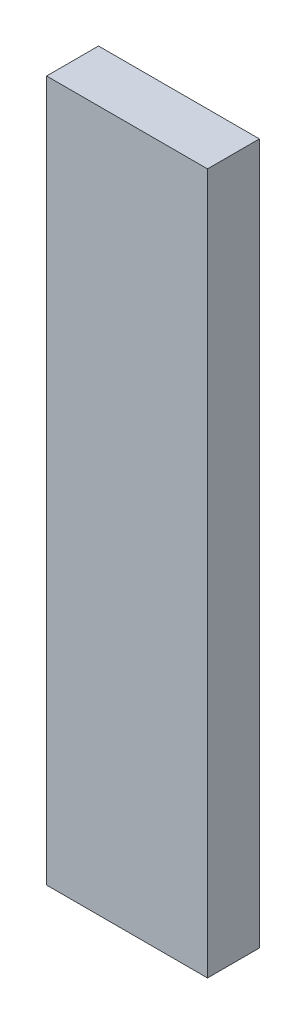
ISO-10303-21;
HEADER;
FILE_DESCRIPTION(('STEP AP214'),'2;1');
FILE_NAME('part.step','',(''),(''),'','','');
FILE_SCHEMA(('AUTOMOTIVE_DESIGN { 1 0 10303 214 1 1 1 1 }'));
ENDSEC;
DATA;
#1=APPLICATION_CONTEXT('core data for automotive mechanical design processes');
#2=APPLICATION_PROTOCOL_DEFINITION('international standard','automotive_design',2000,#1);
#3=PRODUCT_CONTEXT('',#1,'mechanical');
#4=PRODUCT('Part','Part','',(#3));
#5=PRODUCT_RELATED_PRODUCT_CATEGORY('part','',(#4));
#6=PRODUCT_DEFINITION_FORMATION('','',#4);
#7=PRODUCT_DEFINITION_CONTEXT('part definition',#1,'design');
#8=PRODUCT_DEFINITION('design','',#6,#7);
#9=PRODUCT_DEFINITION_SHAPE('','',#8);
#10=(LENGTH_UNIT() NAMED_UNIT(*) SI_UNIT(.MILLI.,.METRE.));
#11=(NAMED_UNIT(*) PLANE_ANGLE_UNIT() SI_UNIT($,.RADIAN.));
#12=(NAMED_UNIT(*) SI_UNIT($,.STERADIAN.) SOLID_ANGLE_UNIT());
#13=UNCERTAINTY_MEASURE_WITH_UNIT(LENGTH_MEASURE(1.E-05),#10,'distance_accuracy_value','');
#14=(GEOMETRIC_REPRESENTATION_CONTEXT(3) GLOBAL_UNCERTAINTY_ASSIGNED_CONTEXT((#13)) GLOBAL_UNIT_ASSIGNED_CONTEXT((#10,
#11,#12)) REPRESENTATION_CONTEXT('',''));
#15=CARTESIAN_POINT('',(0.,0.,0.));
#16=DIRECTION('',(0.,0.,1.));
#17=DIRECTION('',(1.,0.,0.));
#18=AXIS2_PLACEMENT_3D('',#15,#16,#17);
#19=CARTESIAN_POINT('',(0.,0.,0.));
#20=DIRECTION('',(0.,-1.,0.));
#21=DIRECTION('',(0.,0.,-1.));
#22=AXIS2_PLACEMENT_3D('',#19,#20,#21);
#23=PLANE('',#22);
#24=DIRECTION('',(0.,0.,1.));
#25=VECTOR('',#24,1.);
#26=CARTESIAN_POINT('',(-33.0666666666666,0.,32.6238095238095));
#27=LINE('',#26,#25);
#28=CARTESIAN_POINT('',(-33.0666666666667,0.,12.6238095238095));
#29=VERTEX_POINT('',#28);
#30=CARTESIAN_POINT('',(-33.0666666666666,0.,32.6238095238095));
#31=VERTEX_POINT('',#30);
#32=EDGE_CURVE('E140',#29,#31,#27,.T.);
#33=ORIENTED_EDGE('',*,*,#32,.F.);
#34=DIRECTION('',(-1.,0.,0.));
#35=VECTOR('',#34,1.);
#36=CARTESIAN_POINT('',(-33.0666666666667,0.,12.6238095238095));
#37=LINE('',#36,#35);
#38=CARTESIAN_POINT('',(28.9333333333334,0.,12.6238095238095));
#39=VERTEX_POINT('',#38);
#40=EDGE_CURVE('E85',#39,#29,#37,.T.);
#41=ORIENTED_EDGE('',*,*,#40,.F.);
#42=DIRECTION('',(0.,0.,-1.));
#43=VECTOR('',#42,1.);
#44=CARTESIAN_POINT('',(28.9333333333334,0.,32.6238095238095));
#45=LINE('',#44,#43);
#46=CARTESIAN_POINT('',(28.9333333333334,0.,32.6238095238095));
#47=VERTEX_POINT('',#46);
#48=EDGE_CURVE('E183',#47,#39,#45,.T.);
#49=ORIENTED_EDGE('',*,*,#48,.F.);
#50=DIRECTION('',(1.,0.,0.));
#51=VECTOR('',#50,1.);
#52=CARTESIAN_POINT('',(-33.0666666666666,0.,32.6238095238095));
#53=LINE('',#52,#51);
#54=EDGE_CURVE('E146',#31,#47,#53,.T.);
#55=ORIENTED_EDGE('',*,*,#54,.F.);
#56=EDGE_LOOP('',(#33,#41,#49,#55));
#57=FACE_BOUND('',#56,.T.);
#58=DIRECTION('',(-1.,0.,0.));
#59=VECTOR('',#58,1.);
#60=CARTESIAN_POINT('',(0.,0.,13.8238095238095));
#61=LINE('',#60,#59);
#62=CARTESIAN_POINT('',(27.7333333333334,0.,13.8238095238095));
#63=VERTEX_POINT('',#62);
#64=CARTESIAN_POINT('',(-31.8666666666667,0.,13.8238095238095));
#65=VERTEX_POINT('',#64);
#66=EDGE_CURVE('E134',#63,#65,#61,.T.);
#67=ORIENTED_EDGE('',*,*,#66,.T.);
#68=DIRECTION('',(0.,0.,1.));
#69=VECTOR('',#68,1.);
#70=CARTESIAN_POINT('',(-31.8666666666667,0.,0.));
#71=LINE('',#70,#69);
#72=CARTESIAN_POINT('',(-31.8666666666666,0.,31.4238095238095));
#73=VERTEX_POINT('',#72);
#74=EDGE_CURVE('E160',#65,#73,#71,.T.);
#75=ORIENTED_EDGE('',*,*,#74,.T.);
#76=DIRECTION('',(1.,0.,0.));
#77=VECTOR('',#76,1.);
#78=CARTESIAN_POINT('',(0.,0.,31.4238095238095));
#79=LINE('',#78,#77);
#80=CARTESIAN_POINT('',(27.7333333333334,0.,31.4238095238095));
#81=VERTEX_POINT('',#80);
#82=EDGE_CURVE('E138',#73,#81,#79,.T.);
#83=ORIENTED_EDGE('',*,*,#82,.T.);
#84=DIRECTION('',(0.,0.,-1.));
#85=VECTOR('',#84,1.);
#86=CARTESIAN_POINT('',(27.7333333333334,0.,0.));
#87=LINE('',#86,#85);
#88=EDGE_CURVE('E55',#81,#63,#87,.T.);
#89=ORIENTED_EDGE('',*,*,#88,.T.);
#90=EDGE_LOOP('',(#67,#75,#83,#89));
#91=FACE_BOUND('',#90,.T.);
#92=ADVANCED_FACE('F39',(#57,#91),#23,.T.);
#93=CARTESIAN_POINT('',(-33.0666666666666,270.,32.6238095238095));
#94=DIRECTION('',(1.,0.,0.));
#95=DIRECTION('',(0.,0.,-1.));
#96=AXIS2_PLACEMENT_3D('',#93,#94,#95);
#97=PLANE('',#96);
#98=ORIENTED_EDGE('',*,*,#32,.T.);
#99=DIRECTION('',(0.,-1.,0.));
#100=VECTOR('',#99,1.);
#101=CARTESIAN_POINT('',(-33.0666666666666,270.,32.6238095238095));
#102=LINE('',#101,#100);
#103=CARTESIAN_POINT('',(-33.0666666666666,270.,32.6238095238095));
#104=VERTEX_POINT('',#103);
#105=EDGE_CURVE('E11',#104,#31,#102,.T.);
#106=ORIENTED_EDGE('',*,*,#105,.F.);
#107=DIRECTION('',(0.,0.,1.));
#108=VECTOR('',#107,1.);
#109=CARTESIAN_POINT('',(-33.0666666666666,270.,32.6238095238095));
#110=LINE('',#109,#108);
#111=CARTESIAN_POINT('',(-33.0666666666667,270.,12.6238095238095));
#112=VERTEX_POINT('',#111);
#113=EDGE_CURVE('E170',#112,#104,#110,.T.);
#114=ORIENTED_EDGE('',*,*,#113,.F.);
#115=DIRECTION('',(0.,-1.,0.));
#116=VECTOR('',#115,1.);
#117=CARTESIAN_POINT('',(-33.0666666666667,270.,12.6238095238095));
#118=LINE('',#117,#116);
#119=EDGE_CURVE('E179',#112,#29,#118,.T.);
#120=ORIENTED_EDGE('',*,*,#119,.T.);
#121=EDGE_LOOP('',(#98,#106,#114,#120));
#122=FACE_BOUND('',#121,.T.);
#123=ADVANCED_FACE('F41',(#122),#97,.F.);
#124=CARTESIAN_POINT('',(-33.0666666666666,270.,32.6238095238095));
#125=DIRECTION('',(0.,0.,-1.));
#126=DIRECTION('',(-1.,0.,0.));
#127=AXIS2_PLACEMENT_3D('',#124,#125,#126);
#128=PLANE('',#127);
#129=ORIENTED_EDGE('',*,*,#54,.T.);
#130=DIRECTION('',(0.,-1.,0.));
#131=VECTOR('',#130,1.);
#132=CARTESIAN_POINT('',(28.9333333333334,270.,32.6238095238095));
#133=LINE('',#132,#131);
#134=CARTESIAN_POINT('',(28.9333333333334,270.,32.6238095238095));
#135=VERTEX_POINT('',#134);
#136=EDGE_CURVE('E48',#135,#47,#133,.T.);
#137=ORIENTED_EDGE('',*,*,#136,.F.);
#138=DIRECTION('',(1.,0.,0.));
#139=VECTOR('',#138,1.);
#140=CARTESIAN_POINT('',(-33.0666666666666,270.,32.6238095238095));
#141=LINE('',#140,#139);
#142=EDGE_CURVE('E92',#104,#135,#141,.T.);
#143=ORIENTED_EDGE('',*,*,#142,.F.);
#144=ORIENTED_EDGE('',*,*,#105,.T.);
#145=EDGE_LOOP('',(#129,#137,#143,#144));
#146=FACE_BOUND('',#145,.T.);
#147=ADVANCED_FACE('F214',(#146),#128,.F.);
#148=CARTESIAN_POINT('',(28.9333333333334,270.,32.6238095238095));
#149=DIRECTION('',(-1.,0.,0.));
#150=DIRECTION('',(0.,0.,1.));
#151=AXIS2_PLACEMENT_3D('',#148,#149,#150);
#152=PLANE('',#151);
#153=ORIENTED_EDGE('',*,*,#48,.T.);
#154=DIRECTION('',(0.,-1.,0.));
#155=VECTOR('',#154,1.);
#156=CARTESIAN_POINT('',(28.9333333333334,270.,12.6238095238095));
#157=LINE('',#156,#155);
#158=CARTESIAN_POINT('',(28.9333333333334,270.,12.6238095238095));
#159=VERTEX_POINT('',#158);
#160=EDGE_CURVE('E190',#159,#39,#157,.T.);
#161=ORIENTED_EDGE('',*,*,#160,.F.);
#162=DIRECTION('',(0.,0.,-1.));
#163=VECTOR('',#162,1.);
#164=CARTESIAN_POINT('',(28.9333333333334,270.,32.6238095238095));
#165=LINE('',#164,#163);
#166=EDGE_CURVE('E175',#135,#159,#165,.T.);
#167=ORIENTED_EDGE('',*,*,#166,.F.);
#168=ORIENTED_EDGE('',*,*,#136,.T.);
#169=EDGE_LOOP('',(#153,#161,#167,#168));
#170=FACE_BOUND('',#169,.T.);
#171=ADVANCED_FACE('F197',(#170),#152,.F.);
#172=CARTESIAN_POINT('',(-33.0666666666667,270.,12.6238095238095));
#173=DIRECTION('',(0.,0.,1.));
#174=DIRECTION('',(1.,0.,0.));
#175=AXIS2_PLACEMENT_3D('',#172,#173,#174);
#176=PLANE('',#175);
#177=ORIENTED_EDGE('',*,*,#40,.T.);
#178=ORIENTED_EDGE('',*,*,#119,.F.);
#179=DIRECTION('',(-1.,0.,0.));
#180=VECTOR('',#179,1.);
#181=CARTESIAN_POINT('',(-33.0666666666667,270.,12.6238095238095));
#182=LINE('',#181,#180);
#183=EDGE_CURVE('E64',#159,#112,#182,.T.);
#184=ORIENTED_EDGE('',*,*,#183,.F.);
#185=ORIENTED_EDGE('',*,*,#160,.T.);
#186=EDGE_LOOP('',(#177,#178,#184,#185));
#187=FACE_BOUND('',#186,.T.);
#188=ADVANCED_FACE('F205',(#187),#176,.F.);
#189=CARTESIAN_POINT('',(0.,270.,0.));
#190=DIRECTION('',(0.,-1.,0.));
#191=DIRECTION('',(0.,0.,-1.));
#192=AXIS2_PLACEMENT_3D('',#189,#190,#191);
#193=PLANE('',#192);
#194=ORIENTED_EDGE('',*,*,#113,.T.);
#195=ORIENTED_EDGE('',*,*,#142,.T.);
#196=ORIENTED_EDGE('',*,*,#166,.T.);
#197=ORIENTED_EDGE('',*,*,#183,.T.);
#198=EDGE_LOOP('',(#194,#195,#196,#197));
#199=FACE_BOUND('',#198,.T.);
#200=ADVANCED_FACE('F207',(#199),#193,.F.);
#201=CARTESIAN_POINT('',(-31.8666666666666,270.,32.6238095238095));
#202=DIRECTION('',(1.,0.,0.));
#203=DIRECTION('',(0.,0.,-1.));
#204=AXIS2_PLACEMENT_3D('',#201,#202,#203);
#205=PLANE('',#204);
#206=ORIENTED_EDGE('',*,*,#74,.F.);
#207=DIRECTION('',(0.,-1.,0.));
#208=VECTOR('',#207,1.);
#209=CARTESIAN_POINT('',(-31.8666666666667,270.,13.8238095238095));
#210=LINE('',#209,#208);
#211=CARTESIAN_POINT('',(-31.8666666666667,268.8,13.8238095238095));
#212=VERTEX_POINT('',#211);
#213=EDGE_CURVE('E132',#212,#65,#210,.T.);
#214=ORIENTED_EDGE('',*,*,#213,.F.);
#215=DIRECTION('',(0.,0.,1.));
#216=VECTOR('',#215,1.);
#217=CARTESIAN_POINT('',(-31.8666666666667,268.8,0.));
#218=LINE('',#217,#216);
#219=CARTESIAN_POINT('',(-31.8666666666666,268.8,31.4238095238095));
#220=VERTEX_POINT('',#219);
#221=EDGE_CURVE('E119',#212,#220,#218,.T.);
#222=ORIENTED_EDGE('',*,*,#221,.T.);
#223=DIRECTION('',(0.,-1.,0.));
#224=VECTOR('',#223,1.);
#225=CARTESIAN_POINT('',(-31.8666666666666,270.,31.4238095238095));
#226=LINE('',#225,#224);
#227=EDGE_CURVE('E130',#220,#73,#226,.T.);
#228=ORIENTED_EDGE('',*,*,#227,.T.);
#229=EDGE_LOOP('',(#206,#214,#222,#228));
#230=FACE_BOUND('',#229,.T.);
#231=ADVANCED_FACE('F129',(#230),#205,.T.);
#232=CARTESIAN_POINT('',(-33.0666666666666,270.,31.4238095238095));
#233=DIRECTION('',(0.,0.,-1.));
#234=DIRECTION('',(-1.,0.,0.));
#235=AXIS2_PLACEMENT_3D('',#232,#233,#234);
#236=PLANE('',#235);
#237=ORIENTED_EDGE('',*,*,#82,.F.);
#238=ORIENTED_EDGE('',*,*,#227,.F.);
#239=DIRECTION('',(1.,0.,0.));
#240=VECTOR('',#239,1.);
#241=CARTESIAN_POINT('',(0.,268.8,31.4238095238095));
#242=LINE('',#241,#240);
#243=CARTESIAN_POINT('',(27.7333333333334,268.8,31.4238095238095));
#244=VERTEX_POINT('',#243);
#245=EDGE_CURVE('E115',#220,#244,#242,.T.);
#246=ORIENTED_EDGE('',*,*,#245,.T.);
#247=DIRECTION('',(0.,-1.,0.));
#248=VECTOR('',#247,1.);
#249=CARTESIAN_POINT('',(27.7333333333334,270.,31.4238095238095));
#250=LINE('',#249,#248);
#251=EDGE_CURVE('E141',#244,#81,#250,.T.);
#252=ORIENTED_EDGE('',*,*,#251,.T.);
#253=EDGE_LOOP('',(#237,#238,#246,#252));
#254=FACE_BOUND('',#253,.T.);
#255=ADVANCED_FACE('F136',(#254),#236,.T.);
#256=CARTESIAN_POINT('',(27.7333333333334,270.,32.6238095238095));
#257=DIRECTION('',(-1.,0.,0.));
#258=DIRECTION('',(0.,0.,1.));
#259=AXIS2_PLACEMENT_3D('',#256,#257,#258);
#260=PLANE('',#259);
#261=ORIENTED_EDGE('',*,*,#88,.F.);
#262=ORIENTED_EDGE('',*,*,#251,.F.);
#263=DIRECTION('',(0.,0.,-1.));
#264=VECTOR('',#263,1.);
#265=CARTESIAN_POINT('',(27.7333333333334,268.8,0.));
#266=LINE('',#265,#264);
#267=CARTESIAN_POINT('',(27.7333333333334,268.8,13.8238095238095));
#268=VERTEX_POINT('',#267);
#269=EDGE_CURVE('E120',#244,#268,#266,.T.);
#270=ORIENTED_EDGE('',*,*,#269,.T.);
#271=DIRECTION('',(0.,-1.,0.));
#272=VECTOR('',#271,1.);
#273=CARTESIAN_POINT('',(27.7333333333334,270.,13.8238095238095));
#274=LINE('',#273,#272);
#275=EDGE_CURVE('E148',#268,#63,#274,.T.);
#276=ORIENTED_EDGE('',*,*,#275,.T.);
#277=EDGE_LOOP('',(#261,#262,#270,#276));
#278=FACE_BOUND('',#277,.T.);
#279=ADVANCED_FACE('F227',(#278),#260,.T.);
#280=CARTESIAN_POINT('',(-33.0666666666667,270.,13.8238095238095));
#281=DIRECTION('',(0.,0.,1.));
#282=DIRECTION('',(1.,0.,0.));
#283=AXIS2_PLACEMENT_3D('',#280,#281,#282);
#284=PLANE('',#283);
#285=ORIENTED_EDGE('',*,*,#66,.F.);
#286=ORIENTED_EDGE('',*,*,#275,.F.);
#287=DIRECTION('',(-1.,0.,0.));
#288=VECTOR('',#287,1.);
#289=CARTESIAN_POINT('',(0.,268.8,13.8238095238095));
#290=LINE('',#289,#288);
#291=EDGE_CURVE('E152',#268,#212,#290,.T.);
#292=ORIENTED_EDGE('',*,*,#291,.T.);
#293=ORIENTED_EDGE('',*,*,#213,.T.);
#294=EDGE_LOOP('',(#285,#286,#292,#293));
#295=FACE_BOUND('',#294,.T.);
#296=ADVANCED_FACE('F224',(#295),#284,.T.);
#297=CARTESIAN_POINT('',(0.,268.8,0.));
#298=DIRECTION('',(0.,-1.,0.));
#299=DIRECTION('',(0.,0.,-1.));
#300=AXIS2_PLACEMENT_3D('',#297,#298,#299);
#301=PLANE('',#300);
#302=ORIENTED_EDGE('',*,*,#221,.F.);
#303=ORIENTED_EDGE('',*,*,#291,.F.);
#304=ORIENTED_EDGE('',*,*,#269,.F.);
#305=ORIENTED_EDGE('',*,*,#245,.F.);
#306=EDGE_LOOP('',(#302,#303,#304,#305));
#307=FACE_BOUND('',#306,.T.);
#308=ADVANCED_FACE('F117',(#307),#301,.T.);
#309=CLOSED_SHELL('',(#92,#123,#147,#171,#188,#200,#231,#255,#279,#296,#308));
#310=MANIFOLD_SOLID_BREP('B2',#309);
#311=ADVANCED_BREP_SHAPE_REPRESENTATION('',(#18,#310),#14);
#312=SHAPE_DEFINITION_REPRESENTATION(#9,#311);
ENDSEC;
END-ISO-10303-21;
